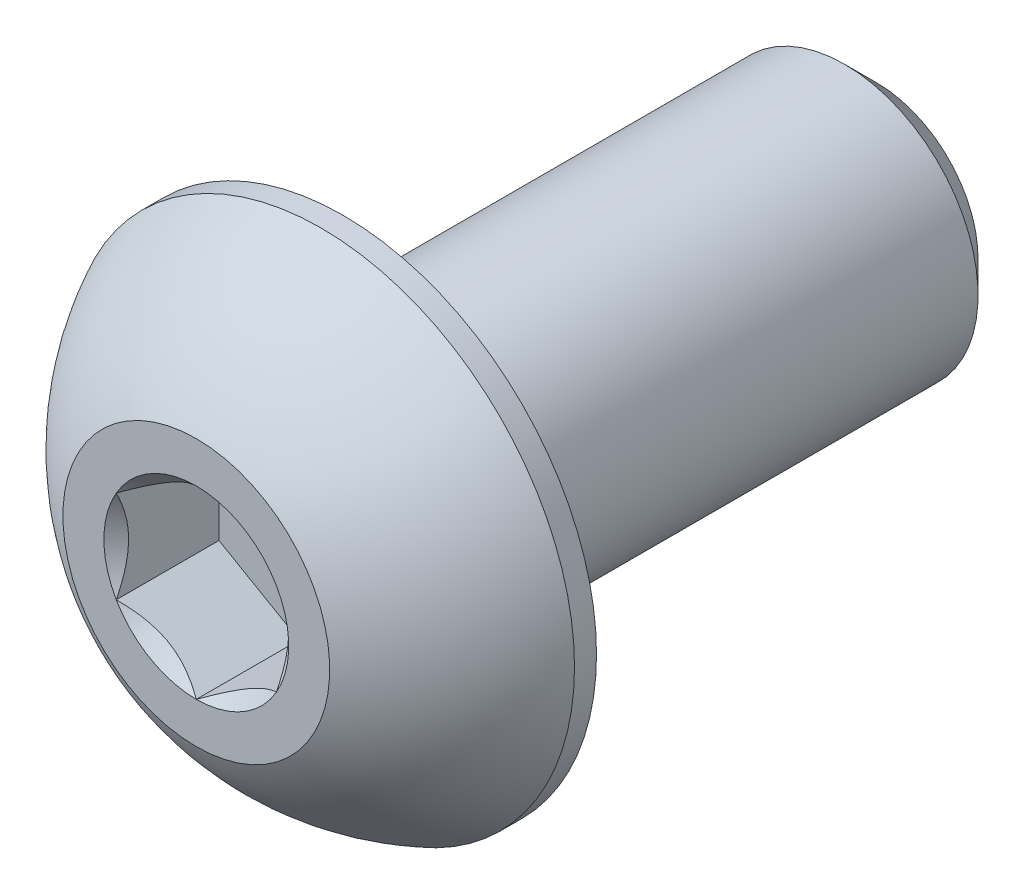
ISO-10303-21;
HEADER;
FILE_DESCRIPTION(('STEP AP214'),'2;1');
FILE_NAME('part.step','',(''),(''),'','','');
FILE_SCHEMA(('AUTOMOTIVE_DESIGN { 1 0 10303 214 1 1 1 1 }'));
ENDSEC;
DATA;
#1=APPLICATION_CONTEXT('core data for automotive mechanical design processes');
#2=APPLICATION_PROTOCOL_DEFINITION('international standard','automotive_design',2000,#1);
#3=PRODUCT_CONTEXT('',#1,'mechanical');
#4=PRODUCT('Part','Part','',(#3));
#5=PRODUCT_RELATED_PRODUCT_CATEGORY('part','',(#4));
#6=PRODUCT_DEFINITION_FORMATION('','',#4);
#7=PRODUCT_DEFINITION_CONTEXT('part definition',#1,'design');
#8=PRODUCT_DEFINITION('design','',#6,#7);
#9=PRODUCT_DEFINITION_SHAPE('','',#8);
#10=(LENGTH_UNIT() NAMED_UNIT(*) SI_UNIT(.MILLI.,.METRE.));
#11=(NAMED_UNIT(*) PLANE_ANGLE_UNIT() SI_UNIT($,.RADIAN.));
#12=(NAMED_UNIT(*) SI_UNIT($,.STERADIAN.) SOLID_ANGLE_UNIT());
#13=UNCERTAINTY_MEASURE_WITH_UNIT(LENGTH_MEASURE(1.E-05),#10,'distance_accuracy_value','');
#14=(GEOMETRIC_REPRESENTATION_CONTEXT(3) GLOBAL_UNCERTAINTY_ASSIGNED_CONTEXT((#13)) GLOBAL_UNIT_ASSIGNED_CONTEXT((#10,
#11,#12)) REPRESENTATION_CONTEXT('',''));
#15=CARTESIAN_POINT('',(0.,0.,0.));
#16=DIRECTION('',(0.,0.,1.));
#17=DIRECTION('',(1.,0.,0.));
#18=AXIS2_PLACEMENT_3D('',#15,#16,#17);
#19=CARTESIAN_POINT('',(0.,-2.5,-12.75));
#20=DIRECTION('',(0.,0.,-1.));
#21=DIRECTION('',(0.,1.,0.));
#22=AXIS2_PLACEMENT_3D('',#19,#20,#21);
#23=PLANE('',#22);
#24=CARTESIAN_POINT('',(0.,0.,-12.75));
#25=DIRECTION('',(0.,0.,-1.));
#26=DIRECTION('',(0.,1.,0.));
#27=AXIS2_PLACEMENT_3D('',#24,#25,#26);
#28=CIRCLE('',#27,1.9);
#29=CARTESIAN_POINT('',(0.,1.9,-12.75));
#30=VERTEX_POINT('',#29);
#31=EDGE_CURVE('E174',#30,#30,#28,.T.);
#32=ORIENTED_EDGE('',*,*,#31,.T.);
#33=EDGE_LOOP('',(#32));
#34=FACE_BOUND('',#33,.T.);
#35=ADVANCED_FACE('F34',(#34),#23,.T.);
#36=CARTESIAN_POINT('',(0.,0.,-12.75));
#37=DIRECTION('',(0.,0.,-1.));
#38=DIRECTION('',(0.,1.,0.));
#39=AXIS2_PLACEMENT_3D('',#36,#37,#38);
#40=CYLINDRICAL_SURFACE('',#39,2.5);
#41=CARTESIAN_POINT('',(0.,0.,-12.15));
#42=DIRECTION('',(0.,0.,-1.));
#43=DIRECTION('',(0.,1.,0.));
#44=AXIS2_PLACEMENT_3D('',#41,#42,#43);
#45=CIRCLE('',#44,2.5);
#46=CARTESIAN_POINT('',(0.,2.5,-12.15));
#47=VERTEX_POINT('',#46);
#48=EDGE_CURVE('E48',#47,#47,#45,.F.);
#49=ORIENTED_EDGE('',*,*,#48,.T.);
#50=EDGE_LOOP('',(#49));
#51=FACE_BOUND('',#50,.T.);
#52=CARTESIAN_POINT('',(0.,0.,-2.75));
#53=DIRECTION('',(0.,0.,1.));
#54=DIRECTION('',(1.,0.,0.));
#55=AXIS2_PLACEMENT_3D('',#52,#53,#54);
#56=CIRCLE('',#55,2.5);
#57=CARTESIAN_POINT('',(2.5,0.,-2.75));
#58=VERTEX_POINT('',#57);
#59=EDGE_CURVE('E171',#58,#58,#56,.F.);
#60=ORIENTED_EDGE('',*,*,#59,.T.);
#61=EDGE_LOOP('',(#60));
#62=FACE_BOUND('',#61,.T.);
#63=ADVANCED_FACE('F179',(#51,#62),#40,.T.);
#64=CARTESIAN_POINT('',(0.,0.,-12.75));
#65=DIRECTION('',(0.,0.,1.));
#66=DIRECTION('',(0.,-1.,0.));
#67=AXIS2_PLACEMENT_3D('',#64,#65,#66);
#68=CONICAL_SURFACE('',#67,1.9,0.785398163397447);
#69=ORIENTED_EDGE('',*,*,#48,.F.);
#70=EDGE_LOOP('',(#69));
#71=FACE_BOUND('',#70,.T.);
#72=ORIENTED_EDGE('',*,*,#31,.F.);
#73=EDGE_LOOP('',(#72));
#74=FACE_BOUND('',#73,.T.);
#75=ADVANCED_FACE('F36',(#71,#74),#68,.T.);
#76=CARTESIAN_POINT('',(0.,0.,-4.65805481283422));
#77=DIRECTION('',(0.,0.,1.));
#78=DIRECTION('',(0.,-1.,0.));
#79=AXIS2_PLACEMENT_3D('',#76,#77,#78);
#80=SPHERICAL_SURFACE('',#79,5.28653711226622);
#81=CARTESIAN_POINT('',(0.,0.,0.));
#82=DIRECTION('',(0.,0.,1.));
#83=DIRECTION('',(1.,0.,0.));
#84=AXIS2_PLACEMENT_3D('',#81,#82,#83);
#85=CIRCLE('',#84,2.5);
#86=CARTESIAN_POINT('',(0.,-2.5,0.));
#87=VERTEX_POINT('',#86);
#88=EDGE_CURVE('E168',#87,#87,#85,.T.);
#89=CARTESIAN_POINT('',(0.,0.,-2.3375));
#90=DIRECTION('',(0.,0.,1.));
#91=DIRECTION('',(1.,0.,0.));
#92=AXIS2_PLACEMENT_3D('',#89,#90,#91);
#93=CIRCLE('',#92,4.75);
#94=CARTESIAN_POINT('',(0.,-4.75,-2.3375));
#95=VERTEX_POINT('',#94);
#96=EDGE_CURVE('E162',#95,#95,#93,.T.);
#97=CARTESIAN_POINT('',(0.,-2.5,0.));
#98=CARTESIAN_POINT('',(0.,-2.53026679982017,-0.016244282455609));
#99=CARTESIAN_POINT('',(0.,-2.56037522904968,-0.0327836412064128));
#100=CARTESIAN_POINT('',(0.,-2.62026400427657,-0.0664460518821871));
#101=CARTESIAN_POINT('',(0.,-2.65004435027396,-0.0835691038071575));
#102=CARTESIAN_POINT('',(0.,-2.70926561698584,-0.11839244141504));
#103=CARTESIAN_POINT('',(0.,-2.73870653770032,-0.136092727097952));
#104=CARTESIAN_POINT('',(0.,-2.79723777417103,-0.172063794044945));
#105=CARTESIAN_POINT('',(0.,-2.82632808992726,-0.190334575309027));
#106=CARTESIAN_POINT('',(0.,-2.8841470610759,-0.227439694392676));
#107=CARTESIAN_POINT('',(0.,-2.91287571646831,-0.246274032212244));
#108=CARTESIAN_POINT('',(0.,-2.96996045130294,-0.284499106978588));
#109=CARTESIAN_POINT('',(0.,-2.99831653074515,-0.303889843925365));
#110=CARTESIAN_POINT('',(0.,-3.05464533901892,-0.343220349244854));
#111=CARTESIAN_POINT('',(0.,-3.08261806785047,-0.363160117617566));
#112=CARTESIAN_POINT('',(0.,-3.13816954607727,-0.403581109164589));
#113=CARTESIAN_POINT('',(0.,-3.16574829547251,-0.424062332338901));
#114=CARTESIAN_POINT('',(0.,-3.22050133565615,-0.465558451209038));
#115=CARTESIAN_POINT('',(0.,-3.24767562644455,-0.486573346904865));
#116=CARTESIAN_POINT('',(0.,-3.30160942393942,-0.529128825735185));
#117=CARTESIAN_POINT('',(0.,-3.32836893064589,-0.550669408869678));
#118=CARTESIAN_POINT('',(0.,-3.38146299210494,-0.594268077753708));
#119=CARTESIAN_POINT('',(0.,-3.40779754685753,-0.616326163503246));
#120=CARTESIAN_POINT('',(0.,-3.46003169800773,-0.660951456155511));
#121=CARTESIAN_POINT('',(0.,-3.48593129440535,-0.683518663058237));
#122=CARTESIAN_POINT('',(0.,-3.53728568771641,-0.729153623103509));
#123=CARTESIAN_POINT('',(0.,-3.56274048462986,-0.752221376246055));
#124=CARTESIAN_POINT('',(0.,-3.61319560685493,-0.798848663663778));
#125=CARTESIAN_POINT('',(0.,-3.63819593216655,-0.822408197938956));
#126=CARTESIAN_POINT('',(0.,-3.68773261175691,-0.870010095651582));
#127=CARTESIAN_POINT('',(0.,-3.71226896603565,-0.89405245908903));
#128=CARTESIAN_POINT('',(0.,-3.76086838042534,-0.942610879694118));
#129=CARTESIAN_POINT('',(0.,-3.78493144053629,-0.967126936861757));
#130=CARTESIAN_POINT('',(0.,-3.83257512329416,-1.01662342950466));
#131=CARTESIAN_POINT('',(0.,-3.85615574594108,-1.04160386497992));
#132=CARTESIAN_POINT('',(0.,-3.90282559378753,-1.0920196223646));
#133=CARTESIAN_POINT('',(0.,-3.92591481898706,-1.11745494427402));
#134=CARTESIAN_POINT('',(0.,-3.97159309867276,-1.1687708098093));
#135=CARTESIAN_POINT('',(0.,-3.99418215315894,-1.19465135343517));
#136=CARTESIAN_POINT('',(0.,-4.03885150820303,-1.24684782851373));
#137=CARTESIAN_POINT('',(0.,-4.06093180876094,-1.27316375996643));
#138=CARTESIAN_POINT('',(0.,-4.10457526604591,-1.32622101137371));
#139=CARTESIAN_POINT('',(0.,-4.12613842277298,-1.3529623313283));
#140=CARTESIAN_POINT('',(0.,-4.16873939899418,-1.40686019877854));
#141=CARTESIAN_POINT('',(0.,-4.1897772184883,-1.4340167462742));
#142=CARTESIAN_POINT('',(0.,-4.23131952645464,-1.488734750071));
#143=CARTESIAN_POINT('',(0.,-4.25182401492686,-1.51629620637214));
#144=CARTESIAN_POINT('',(0.,-4.29229186971308,-1.5718135551894));
#145=CARTESIAN_POINT('',(0.,-4.31225523602708,-1.59976944770551));
#146=CARTESIAN_POINT('',(0.,-4.35163326096594,-1.65606504649041));
#147=CARTESIAN_POINT('',(0.,-4.3710479195908,-1.6844047527592));
#148=CARTESIAN_POINT('',(0.,-4.40932115213664,-1.74145721073709));
#149=CARTESIAN_POINT('',(0.,-4.42817972605763,-1.77016996244618));
#150=CARTESIAN_POINT('',(0.,-4.46533362339398,-1.82795760128832));
#151=CARTESIAN_POINT('',(0.,-4.48362894680934,-1.85703248842136));
#152=CARTESIAN_POINT('',(0.,-4.51964939166499,-1.91553335033324));
#153=CARTESIAN_POINT('',(0.,-4.53737451310527,-1.94495932511208));
#154=CARTESIAN_POINT('',(0.,-4.57224781803529,-2.00415118173237));
#155=CARTESIAN_POINT('',(0.,-4.58939600152503,-2.03391706357382));
#156=CARTESIAN_POINT('',(0.,-4.62310891815402,-2.09377742234707));
#157=CARTESIAN_POINT('',(0.,-4.63967365129327,-2.12387189927887));
#158=CARTESIAN_POINT('',(0.,-4.67221336026297,-2.18437801974018));
#159=CARTESIAN_POINT('',(0.,-4.68818833609342,-2.21478966326969));
#160=CARTESIAN_POINT('',(0.,-4.71954250823692,-2.27591853680649));
#161=CARTESIAN_POINT('',(0.,-4.73492170454996,-2.30663576681378));
#162=CARTESIAN_POINT('',(0.,-4.75,-2.3375));
#163=B_SPLINE_CURVE_WITH_KNOTS('',3,(#97,#98,#99,#100,#101,#102,#103,#104,#105,#106,#107,#108,
#109,#110,#111,#112,#113,#114,#115,#116,#117,#118,#119,#120,#121,#122,#123,#124,#125,#126,#127,
#128,#129,#130,#131,#132,#133,#134,#135,#136,#137,#138,#139,#140,#141,#142,#143,#144,#145,#146,
#147,#148,#149,#150,#151,#152,#153,#154,#155,#156,#157,#158,#159,#160,#161,#162),.UNSPECIFIED.,
.F.,.F.,(4,2,2,2,2,2,2,2,2,2,2,2,2,2,2,2,2,2,2,2,2,2,2,2,2,2,2,2,2,2,2,2,4),(0.,
0.10304982363783,0.206099647275662,0.309149470913491,0.412199294551322,0.515249118189152,
0.618298941826983,0.721348765464812,0.824398589102643,0.927448412740473,1.0304982363783,
1.13354806001613,1.23659788365396,1.33964770729179,1.44269753092962,1.54574735456745,
1.64879717820529,1.75184700184312,1.85489682548095,1.95794664911878,2.06099647275661,
2.16404629639444,2.26709612003227,2.3701459436701,2.47319576730793,2.57624559094576,
2.67929541458359,2.78234523822142,2.88539506185925,2.98844488549708,3.09149470913491,
3.19454453277274,3.29759435641057),.UNSPECIFIED.);
#164=EDGE_CURVE('BSEAM184',#87,#95,#163,.T.);
#165=ORIENTED_EDGE('',*,*,#88,.F.);
#166=ORIENTED_EDGE('',*,*,#96,.T.);
#167=ORIENTED_EDGE('',*,*,#164,.T.);
#168=ORIENTED_EDGE('',*,*,#164,.F.);
#169=EDGE_LOOP('',(#165,#167,#166,#168));
#170=FACE_BOUND('',#169,.T.);
#171=ADVANCED_FACE('F184',(#170),#80,.T.);
#172=CARTESIAN_POINT('',(0.,-2.5,0.));
#173=DIRECTION('',(0.,0.,-1.));
#174=DIRECTION('',(-1.,0.,0.));
#175=AXIS2_PLACEMENT_3D('',#172,#173,#174);
#176=PLANE('',#175);
#177=CARTESIAN_POINT('',(0.,0.,0.));
#178=DIRECTION('',(0.,0.,1.));
#179=DIRECTION('',(1.,0.,0.));
#180=AXIS2_PLACEMENT_3D('',#177,#178,#179);
#181=CIRCLE('',#180,1.73205080756888);
#182=CARTESIAN_POINT('',(-1.5,0.866025403784438,0.));
#183=VERTEX_POINT('',#182);
#184=CARTESIAN_POINT('',(-1.5,-0.866025403784439,0.));
#185=VERTEX_POINT('',#184);
#186=EDGE_CURVE('E61',#183,#185,#181,.T.);
#187=ORIENTED_EDGE('',*,*,#186,.F.);
#188=CARTESIAN_POINT('',(0.,1.73205080756888,0.));
#189=VERTEX_POINT('',#188);
#190=EDGE_CURVE('E133',#189,#183,#181,.T.);
#191=ORIENTED_EDGE('',*,*,#190,.F.);
#192=CARTESIAN_POINT('',(1.5,0.866025403784439,0.));
#193=VERTEX_POINT('',#192);
#194=EDGE_CURVE('E130',#193,#189,#181,.T.);
#195=ORIENTED_EDGE('',*,*,#194,.F.);
#196=CARTESIAN_POINT('',(1.5,-0.866025403784439,0.));
#197=VERTEX_POINT('',#196);
#198=EDGE_CURVE('E101',#197,#193,#181,.T.);
#199=ORIENTED_EDGE('',*,*,#198,.F.);
#200=CARTESIAN_POINT('',(0.,-1.73205080756888,0.));
#201=VERTEX_POINT('',#200);
#202=EDGE_CURVE('E93',#201,#197,#181,.T.);
#203=ORIENTED_EDGE('',*,*,#202,.F.);
#204=EDGE_CURVE('E54',#185,#201,#181,.T.);
#205=ORIENTED_EDGE('',*,*,#204,.F.);
#206=EDGE_LOOP('',(#187,#191,#195,#199,#203,#205));
#207=FACE_BOUND('',#206,.T.);
#208=ORIENTED_EDGE('',*,*,#88,.T.);
#209=EDGE_LOOP('',(#208));
#210=FACE_BOUND('',#209,.T.);
#211=ADVANCED_FACE('F127',(#207,#210),#176,.F.);
#212=CARTESIAN_POINT('',(0.,-4.75,-2.75));
#213=DIRECTION('',(0.,0.,1.));
#214=DIRECTION('',(1.,0.,0.));
#215=AXIS2_PLACEMENT_3D('',#212,#213,#214);
#216=PLANE('',#215);
#217=ORIENTED_EDGE('',*,*,#59,.F.);
#218=EDGE_LOOP('',(#217));
#219=FACE_BOUND('',#218,.T.);
#220=CARTESIAN_POINT('',(0.,0.,-2.75));
#221=DIRECTION('',(0.,0.,1.));
#222=DIRECTION('',(1.,0.,0.));
#223=AXIS2_PLACEMENT_3D('',#220,#221,#222);
#224=CIRCLE('',#223,4.75);
#225=CARTESIAN_POINT('',(4.75,0.,-2.75));
#226=VERTEX_POINT('',#225);
#227=EDGE_CURVE('E165',#226,#226,#224,.T.);
#228=ORIENTED_EDGE('',*,*,#227,.F.);
#229=EDGE_LOOP('',(#228));
#230=FACE_BOUND('',#229,.T.);
#231=ADVANCED_FACE('F198',(#219,#230),#216,.F.);
#232=CARTESIAN_POINT('',(0.,0.,0.));
#233=DIRECTION('',(0.,0.,1.));
#234=DIRECTION('',(1.,0.,0.));
#235=AXIS2_PLACEMENT_3D('',#232,#233,#234);
#236=CYLINDRICAL_SURFACE('',#235,4.75);
#237=ORIENTED_EDGE('',*,*,#96,.F.);
#238=EDGE_LOOP('',(#237));
#239=FACE_BOUND('',#238,.T.);
#240=ORIENTED_EDGE('',*,*,#227,.T.);
#241=EDGE_LOOP('',(#240));
#242=FACE_BOUND('',#241,.T.);
#243=ADVANCED_FACE('F201',(#239,#242),#236,.T.);
#244=CARTESIAN_POINT('',(0.,0.,0.));
#245=DIRECTION('',(0.,0.,1.));
#246=DIRECTION('',(1.,0.,0.));
#247=AXIS2_PLACEMENT_3D('',#244,#245,#246);
#248=CONICAL_SURFACE('',#247,1.73205080756888,0.78539816339745);
#249=ORIENTED_EDGE('',*,*,#198,.T.);
#250=CARTESIAN_POINT('',(1.5,-1.72720812969692,0.555578516270791));
#251=CARTESIAN_POINT('',(1.5,-1.68515175699268,0.523829907857426));
#252=CARTESIAN_POINT('',(1.5,-1.64286104748673,0.492392593807383));
#253=CARTESIAN_POINT('',(1.5,-1.55771581035942,0.430269087556409));
#254=CARTESIAN_POINT('',(1.5,-1.51486114386668,0.399583085892202));
#255=CARTESIAN_POINT('',(1.5,-1.3846813415127,0.30840719242716));
#256=CARTESIAN_POINT('',(1.5,-1.29637976071654,0.249288343426773));
#257=CARTESIAN_POINT('',(1.5,-1.11121478730467,0.133230996316504));
#258=CARTESIAN_POINT('',(1.5,-1.01415038238167,0.0766095587330078));
#259=CARTESIAN_POINT('',(1.5,-0.815173408897605,-0.0269631187343472));
#260=CARTESIAN_POINT('',(1.5,-0.713278669253285,-0.0739469584583305));
#261=CARTESIAN_POINT('',(1.5,-0.560333774943111,-0.13142733156917));
#262=CARTESIAN_POINT('',(1.5,-0.511547982948042,-0.147924612242751));
#263=CARTESIAN_POINT('',(1.5,-0.412798620136866,-0.177002487072996));
#264=CARTESIAN_POINT('',(1.5,-0.362834968437562,-0.189582811405981));
#265=CARTESIAN_POINT('',(1.5,-0.262863235444982,-0.20996380585323));
#266=CARTESIAN_POINT('',(1.5,-0.212872113808022,-0.21784636725402));
#267=CARTESIAN_POINT('',(1.5,-0.112355243569545,-0.228677936030997));
#268=CARTESIAN_POINT('',(1.5,-0.0618295883726279,-0.231627791475649));
#269=CARTESIAN_POINT('',(1.5,0.037429173332384,-0.23237514227515));
#270=CARTESIAN_POINT('',(1.5,0.0861609672002989,-0.230355266441925));
#271=CARTESIAN_POINT('',(1.5,0.183206937768827,-0.221677447103242));
#272=CARTESIAN_POINT('',(1.5,0.231521073438269,-0.215019053031544));
#273=CARTESIAN_POINT('',(1.5,0.328199853425435,-0.197314755877433));
#274=CARTESIAN_POINT('',(1.5,0.376550616310328,-0.186194188742961));
#275=CARTESIAN_POINT('',(1.5,0.472195697125598,-0.160156585951288));
#276=CARTESIAN_POINT('',(1.5,0.51949010309274,-0.145239867959065));
#277=CARTESIAN_POINT('',(1.5,0.668391282696624,-0.0926647764039276));
#278=CARTESIAN_POINT('',(1.5,0.767878709508552,-0.0490187125280247));
#279=CARTESIAN_POINT('',(1.5,0.962179866690724,0.048022994593097));
#280=CARTESIAN_POINT('',(1.5,1.05697519961444,0.101453665089533));
#281=CARTESIAN_POINT('',(1.5,1.23814273533383,0.211685852004558));
#282=CARTESIAN_POINT('',(1.5,1.3246994218129,0.268187920698596));
#283=CARTESIAN_POINT('',(1.5,1.45222331290673,0.355534301578659));
#284=CARTESIAN_POINT('',(1.5,1.49418091978756,0.384957758680043));
#285=CARTESIAN_POINT('',(1.5,1.57752272931476,0.444582821830463));
#286=CARTESIAN_POINT('',(1.5,1.61890708647354,0.474784211664437));
#287=CARTESIAN_POINT('',(1.5,1.66005278019494,0.505308178609455));
#288=B_SPLINE_CURVE_WITH_KNOTS('',3,(#250,#251,#252,#253,#254,#255,#256,#257,#258,#259,#260,
#261,#262,#263,#264,#265,#266,#267,#268,#269,#270,#271,#272,#273,#274,#275,#276,#277,#278,#279,
#280,#281,#282,#283,#284,#285,#286,#287),.UNSPECIFIED.,.F.,.F.,(4,2,2,2,2,2,2,2,2,2,2,2,2,2,2,2,
2,2,4),(0.,0.158079548982668,0.316198780993942,0.634850417346958,0.97169031136151,
1.30737131660667,1.46173961127089,1.61611853740677,1.7677210142141,1.91929742368538,
2.065387412096,2.21149159305544,2.36014984633872,2.50879566386709,2.83376031422673,
3.15991186985652,3.46985601802197,3.62358896039974,3.7772796264207),.UNSPECIFIED.);
#289=EDGE_CURVE('E11',#197,#193,#288,.T.);
#290=ORIENTED_EDGE('',*,*,#289,.F.);
#291=EDGE_LOOP('',(#249,#290));
#292=FACE_BOUND('',#291,.T.);
#293=ADVANCED_FACE('F105',(#292),#248,.F.);
#294=ORIENTED_EDGE('',*,*,#194,.T.);
#295=CARTESIAN_POINT('',(1.5002,0.865909933730601,0.000115481600073575));
#296=CARTESIAN_POINT('',(1.44863220926292,0.895682611594166,-0.0296345239326721));
#297=CARTESIAN_POINT('',(1.3962020823348,0.925953159489765,-0.0576375160896874));
#298=CARTESIAN_POINT('',(1.2892909659444,0.987678321317124,-0.108910769559858));
#299=CARTESIAN_POINT('',(1.23479980418534,1.01913880822718,-0.132152494955627));
#300=CARTESIAN_POINT('',(1.12492091864275,1.08257741237344,-0.17196627100778));
#301=CARTESIAN_POINT('',(1.0695611909048,1.11453936608521,-0.188638414329104));
#302=CARTESIAN_POINT('',(0.957622742522848,1.1791670593912,-0.214325543181897));
#303=CARTESIAN_POINT('',(0.90104744344699,1.21183082354213,-0.223359709521134));
#304=CARTESIAN_POINT('',(0.803544610483558,1.26812411040032,-0.231510918773148));
#305=CARTESIAN_POINT('',(0.762743091719533,1.29168087824208,-0.232717747010783));
#306=CARTESIAN_POINT('',(0.68121203038414,1.33875285845138,-0.230685942837733));
#307=CARTESIAN_POINT('',(0.640482505685369,1.36226806050018,-0.227446329251692));
#308=CARTESIAN_POINT('',(0.559415597836583,1.40907206156905,-0.216708014018038));
#309=CARTESIAN_POINT('',(0.51907861540171,1.43236062923612,-0.209205346981267));
#310=CARTESIAN_POINT('',(0.439081663085968,1.47854689118997,-0.190348388071709));
#311=CARTESIAN_POINT('',(0.399421991483791,1.50144441326545,-0.178992442981415));
#312=CARTESIAN_POINT('',(0.297836865225514,1.56009461325633,-0.145278352407328));
#313=CARTESIAN_POINT('',(0.23654144629031,1.59548353987866,-0.120378150906633));
#314=CARTESIAN_POINT('',(0.146414371536686,1.64751843074894,-0.0783433467284235));
#315=CARTESIAN_POINT('',(0.116714860092281,1.66466545167617,-0.0635748464409036));
#316=CARTESIAN_POINT('',(0.0578620986162484,1.69864410935691,-0.0326894340598312));
#317=CARTESIAN_POINT('',(0.0287085957793622,1.71547589206761,-0.0165731658782895));
#318=CARTESIAN_POINT('',(-0.000200000000000444,1.73216627762272,0.000115481600073434));
#319=B_SPLINE_CURVE_WITH_KNOTS('',3,(#295,#296,#297,#298,#299,#300,#301,#302,#303,#304,#305,
#306,#307,#308,#309,#310,#311,#312,#313,#314,#315,#316,#317,#318),.UNSPECIFIED.,.F.,.F.,(4,2,2,
2,2,2,2,2,2,2,2,4),(0.,0.199829143693305,0.40082298738239,0.598623720538182,0.795926240188891,
0.937113067959883,1.07833105577193,1.21968061668222,1.36109089931055,1.58570969637566,
1.69770705470964,1.80965120737194),.UNSPECIFIED.);
#320=EDGE_CURVE('E132',#193,#189,#319,.T.);
#321=ORIENTED_EDGE('',*,*,#320,.F.);
#322=EDGE_LOOP('',(#294,#321));
#323=FACE_BOUND('',#322,.T.);
#324=ADVANCED_FACE('F286',(#323),#248,.F.);
#325=ORIENTED_EDGE('',*,*,#190,.T.);
#326=CARTESIAN_POINT('',(0.000199999999999626,1.73216627762272,0.000115481600073681));
#327=CARTESIAN_POINT('',(-0.0513677907370761,1.70239359975915,-0.029634523932672));
#328=CARTESIAN_POINT('',(-0.103797917665201,1.67212305186355,-0.0576375160896872));
#329=CARTESIAN_POINT('',(-0.210709034055597,1.61039789003619,-0.108910769559857));
#330=CARTESIAN_POINT('',(-0.265200195814661,1.57893740312614,-0.132152494955627));
#331=CARTESIAN_POINT('',(-0.375079081357249,1.51549879897987,-0.17196627100778));
#332=CARTESIAN_POINT('',(-0.4304388090952,1.4835368452681,-0.188638414329104));
#333=CARTESIAN_POINT('',(-0.542377257477151,1.41890915196211,-0.214325543181897));
#334=CARTESIAN_POINT('',(-0.598952556553009,1.38624538781118,-0.223359709521134));
#335=CARTESIAN_POINT('',(-0.696455389516441,1.32995210095299,-0.231510918773148));
#336=CARTESIAN_POINT('',(-0.737256908280467,1.30639533311124,-0.232717747010783));
#337=CARTESIAN_POINT('',(-0.818787969615859,1.25932335290193,-0.230685942837733));
#338=CARTESIAN_POINT('',(-0.859517494314631,1.23580815085313,-0.227446329251693));
#339=CARTESIAN_POINT('',(-0.940584402163417,1.18900414978427,-0.216708014018038));
#340=CARTESIAN_POINT('',(-0.980921384598289,1.16571558211719,-0.209205346981267));
#341=CARTESIAN_POINT('',(-1.06091833691403,1.11952932016335,-0.19034838807171));
#342=CARTESIAN_POINT('',(-1.10057800851621,1.09663179808786,-0.178992442981415));
#343=CARTESIAN_POINT('',(-1.20216313477449,1.03798159809698,-0.145278352407329));
#344=CARTESIAN_POINT('',(-1.26345855370969,1.00259267147465,-0.120378150906633));
#345=CARTESIAN_POINT('',(-1.35358562846331,0.950557780604374,-0.0783433467284239));
#346=CARTESIAN_POINT('',(-1.38328513990772,0.933410759677147,-0.0635748464409042));
#347=CARTESIAN_POINT('',(-1.44213790138375,0.899432101996406,-0.0326894340598318));
#348=CARTESIAN_POINT('',(-1.47129140422064,0.882600319285709,-0.0165731658782901));
#349=CARTESIAN_POINT('',(-1.5002,0.8659099337306,0.000115481600073071));
#350=B_SPLINE_CURVE_WITH_KNOTS('',3,(#326,#327,#328,#329,#330,#331,#332,#333,#334,#335,#336,
#337,#338,#339,#340,#341,#342,#343,#344,#345,#346,#347,#348,#349),.UNSPECIFIED.,.F.,.F.,(4,2,2,
2,2,2,2,2,2,2,2,4),(0.,0.199829143693305,0.400822987382389,0.598623720538181,0.79592624018889,
0.937113067959882,1.07833105577193,1.21968061668222,1.36109089931055,1.58570969637566,
1.69770705470964,1.80965120737194),.UNSPECIFIED.);
#351=EDGE_CURVE('E137',#189,#183,#350,.T.);
#352=ORIENTED_EDGE('',*,*,#351,.F.);
#353=EDGE_LOOP('',(#325,#352));
#354=FACE_BOUND('',#353,.T.);
#355=ADVANCED_FACE('F140',(#354),#248,.F.);
#356=ORIENTED_EDGE('',*,*,#186,.T.);
#357=CARTESIAN_POINT('',(-1.5,-1.72720812969693,0.555578516270791));
#358=CARTESIAN_POINT('',(-1.5,-1.68515175699268,0.523829907857427));
#359=CARTESIAN_POINT('',(-1.5,-1.64286104748674,0.492392593807383));
#360=CARTESIAN_POINT('',(-1.5,-1.55771581035942,0.430269087556409));
#361=CARTESIAN_POINT('',(-1.5,-1.51486114386668,0.399583085892202));
#362=CARTESIAN_POINT('',(-1.5,-1.3846813415127,0.30840719242716));
#363=CARTESIAN_POINT('',(-1.5,-1.29637976071654,0.249288343426773));
#364=CARTESIAN_POINT('',(-1.5,-1.11121478730467,0.133230996316504));
#365=CARTESIAN_POINT('',(-1.5,-1.01415038238167,0.076609558733008));
#366=CARTESIAN_POINT('',(-1.5,-0.815173408897606,-0.026963118734347));
#367=CARTESIAN_POINT('',(-1.5,-0.713278669253285,-0.0739469584583305));
#368=CARTESIAN_POINT('',(-1.5,-0.560333774943112,-0.13142733156917));
#369=CARTESIAN_POINT('',(-1.5,-0.511547982948042,-0.147924612242751));
#370=CARTESIAN_POINT('',(-1.5,-0.412798620136866,-0.177002487072996));
#371=CARTESIAN_POINT('',(-1.5,-0.362834968437562,-0.189582811405981));
#372=CARTESIAN_POINT('',(-1.5,-0.262863235444982,-0.20996380585323));
#373=CARTESIAN_POINT('',(-1.5,-0.212872113808022,-0.21784636725402));
#374=CARTESIAN_POINT('',(-1.5,-0.112355243569545,-0.228677936030997));
#375=CARTESIAN_POINT('',(-1.5,-0.0618295883726279,-0.231627791475649));
#376=CARTESIAN_POINT('',(-1.5,0.0374291733323841,-0.23237514227515));
#377=CARTESIAN_POINT('',(-1.5,0.0861609672002989,-0.230355266441925));
#378=CARTESIAN_POINT('',(-1.5,0.183206937768827,-0.221677447103242));
#379=CARTESIAN_POINT('',(-1.5,0.231521073438269,-0.215019053031544));
#380=CARTESIAN_POINT('',(-1.5,0.328199853425435,-0.197314755877433));
#381=CARTESIAN_POINT('',(-1.5,0.376550616310328,-0.186194188742961));
#382=CARTESIAN_POINT('',(-1.5,0.472195697125598,-0.160156585951288));
#383=CARTESIAN_POINT('',(-1.5,0.51949010309274,-0.145239867959065));
#384=CARTESIAN_POINT('',(-1.5,0.668391282696624,-0.0926647764039277));
#385=CARTESIAN_POINT('',(-1.5,0.767878709508553,-0.0490187125280249));
#386=CARTESIAN_POINT('',(-1.5,0.962179866690724,0.0480229945930968));
#387=CARTESIAN_POINT('',(-1.5,1.05697519961444,0.101453665089533));
#388=CARTESIAN_POINT('',(-1.5,1.23814273533383,0.211685852004558));
#389=CARTESIAN_POINT('',(-1.5,1.3246994218129,0.268187920698596));
#390=CARTESIAN_POINT('',(-1.5,1.45222331290673,0.355534301578659));
#391=CARTESIAN_POINT('',(-1.5,1.49418091978756,0.384957758680043));
#392=CARTESIAN_POINT('',(-1.5,1.57752272931476,0.444582821830464));
#393=CARTESIAN_POINT('',(-1.5,1.61890708647354,0.474784211664437));
#394=CARTESIAN_POINT('',(-1.5,1.66005278019494,0.505308178609456));
#395=B_SPLINE_CURVE_WITH_KNOTS('',3,(#357,#358,#359,#360,#361,#362,#363,#364,#365,#366,#367,
#368,#369,#370,#371,#372,#373,#374,#375,#376,#377,#378,#379,#380,#381,#382,#383,#384,#385,#386,
#387,#388,#389,#390,#391,#392,#393,#394),.UNSPECIFIED.,.F.,.F.,(4,2,2,2,2,2,2,2,2,2,2,2,2,2,2,2,
2,2,4),(0.,0.158079548982669,0.316198780993942,0.634850417346958,0.97169031136151,
1.30737131660667,1.46173961127089,1.61611853740677,1.7677210142141,1.91929742368538,
2.065387412096,2.21149159305544,2.36014984633872,2.5087956638671,2.83376031422673,
3.15991186985652,3.46985601802198,3.62358896039974,3.7772796264207),.UNSPECIFIED.);
#396=EDGE_CURVE('E144',#183,#185,#395,.F.);
#397=ORIENTED_EDGE('',*,*,#396,.F.);
#398=EDGE_LOOP('',(#356,#397));
#399=FACE_BOUND('',#398,.T.);
#400=ADVANCED_FACE('F280',(#399),#248,.F.);
#401=ORIENTED_EDGE('',*,*,#204,.T.);
#402=CARTESIAN_POINT('',(-1.5002,-0.865909933730601,0.000115481600073141));
#403=CARTESIAN_POINT('',(-1.44863220926292,-0.895682611594166,-0.0296345239326724));
#404=CARTESIAN_POINT('',(-1.3962020823348,-0.925953159489765,-0.0576375160896875));
#405=CARTESIAN_POINT('',(-1.2892909659444,-0.987678321317124,-0.108910769559857));
#406=CARTESIAN_POINT('',(-1.23479980418534,-1.01913880822718,-0.132152494955627));
#407=CARTESIAN_POINT('',(-1.12492091864275,-1.08257741237344,-0.17196627100778));
#408=CARTESIAN_POINT('',(-1.0695611909048,-1.11453936608521,-0.188638414329104));
#409=CARTESIAN_POINT('',(-0.957622742522849,-1.1791670593912,-0.214325543181897));
#410=CARTESIAN_POINT('',(-0.901047443446991,-1.21183082354213,-0.223359709521134));
#411=CARTESIAN_POINT('',(-0.803544610483559,-1.26812411040032,-0.231510918773148));
#412=CARTESIAN_POINT('',(-0.762743091719534,-1.29168087824208,-0.232717747010783));
#413=CARTESIAN_POINT('',(-0.681212030384142,-1.33875285845138,-0.230685942837733));
#414=CARTESIAN_POINT('',(-0.64048250568537,-1.36226806050018,-0.227446329251692));
#415=CARTESIAN_POINT('',(-0.559415597836584,-1.40907206156905,-0.216708014018038));
#416=CARTESIAN_POINT('',(-0.519078615401712,-1.43236062923612,-0.209205346981267));
#417=CARTESIAN_POINT('',(-0.439081663085969,-1.47854689118996,-0.19034838807171));
#418=CARTESIAN_POINT('',(-0.399421991483792,-1.50144441326545,-0.178992442981415));
#419=CARTESIAN_POINT('',(-0.297836865225515,-1.56009461325633,-0.145278352407329));
#420=CARTESIAN_POINT('',(-0.236541446290311,-1.59548353987866,-0.120378150906633));
#421=CARTESIAN_POINT('',(-0.146414371536686,-1.64751843074894,-0.0783433467284236));
#422=CARTESIAN_POINT('',(-0.116714860092282,-1.66466545167617,-0.0635748464409036));
#423=CARTESIAN_POINT('',(-0.0578620986162485,-1.69864410935691,-0.0326894340598309));
#424=CARTESIAN_POINT('',(-0.0287085957793622,-1.71547589206761,-0.0165731658782891));
#425=CARTESIAN_POINT('',(0.000200000000000573,-1.73216627762272,0.000115481600073829));
#426=B_SPLINE_CURVE_WITH_KNOTS('',3,(#402,#403,#404,#405,#406,#407,#408,#409,#410,#411,#412,
#413,#414,#415,#416,#417,#418,#419,#420,#421,#422,#423,#424,#425),.UNSPECIFIED.,.F.,.F.,(4,2,2,
2,2,2,2,2,2,2,2,4),(0.,0.199829143693305,0.400822987382389,0.598623720538181,0.795926240188889,
0.937113067959881,1.07833105577193,1.21968061668222,1.36109089931054,1.58570969637565,
1.69770705470964,1.80965120737194),.UNSPECIFIED.);
#427=EDGE_CURVE('E117',#185,#201,#426,.T.);
#428=ORIENTED_EDGE('',*,*,#427,.F.);
#429=EDGE_LOOP('',(#401,#428));
#430=FACE_BOUND('',#429,.T.);
#431=ADVANCED_FACE('F228',(#430),#248,.F.);
#432=ORIENTED_EDGE('',*,*,#202,.T.);
#433=CARTESIAN_POINT('',(-0.00019999999999946,-1.73216627762272,0.000115481600073879));
#434=CARTESIAN_POINT('',(0.0513677907370762,-1.70239359975915,-0.0296345239326719));
#435=CARTESIAN_POINT('',(0.103797917665201,-1.67212305186355,-0.0576375160896871));
#436=CARTESIAN_POINT('',(0.210709034055597,-1.61039789003619,-0.108910769559857));
#437=CARTESIAN_POINT('',(0.265200195814661,-1.57893740312614,-0.132152494955627));
#438=CARTESIAN_POINT('',(0.375079081357249,-1.51549879897987,-0.17196627100778));
#439=CARTESIAN_POINT('',(0.4304388090952,-1.4835368452681,-0.188638414329103));
#440=CARTESIAN_POINT('',(0.542377257477151,-1.41890915196211,-0.214325543181897));
#441=CARTESIAN_POINT('',(0.598952556553009,-1.38624538781118,-0.223359709521134));
#442=CARTESIAN_POINT('',(0.696455389516441,-1.32995210095299,-0.231510918773148));
#443=CARTESIAN_POINT('',(0.737256908280467,-1.30639533311124,-0.232717747010783));
#444=CARTESIAN_POINT('',(0.818787969615859,-1.25932335290193,-0.230685942837732));
#445=CARTESIAN_POINT('',(0.859517494314631,-1.23580815085313,-0.227446329251692));
#446=CARTESIAN_POINT('',(0.940584402163417,-1.18900414978427,-0.216708014018038));
#447=CARTESIAN_POINT('',(0.980921384598289,-1.16571558211719,-0.209205346981267));
#448=CARTESIAN_POINT('',(1.06091833691403,-1.11952932016335,-0.190348388071709));
#449=CARTESIAN_POINT('',(1.10057800851621,-1.09663179808786,-0.178992442981415));
#450=CARTESIAN_POINT('',(1.20216313477449,-1.03798159809698,-0.145278352407328));
#451=CARTESIAN_POINT('',(1.26345855370969,-1.00259267147465,-0.120378150906633));
#452=CARTESIAN_POINT('',(1.35358562846331,-0.950557780604374,-0.0783433467284236));
#453=CARTESIAN_POINT('',(1.38328513990772,-0.933410759677147,-0.0635748464409038));
#454=CARTESIAN_POINT('',(1.44213790138375,-0.899432101996406,-0.0326894340598314));
#455=CARTESIAN_POINT('',(1.47129140422064,-0.88260031928571,-0.0165731658782898));
#456=CARTESIAN_POINT('',(1.5002,-0.865909933730601,0.000115481600073133));
#457=B_SPLINE_CURVE_WITH_KNOTS('',3,(#433,#434,#435,#436,#437,#438,#439,#440,#441,#442,#443,
#444,#445,#446,#447,#448,#449,#450,#451,#452,#453,#454,#455,#456),.UNSPECIFIED.,.F.,.F.,(4,2,2,
2,2,2,2,2,2,2,2,4),(0.,0.199829143693305,0.400822987382389,0.598623720538181,0.79592624018889,
0.937113067959882,1.07833105577193,1.21968061668222,1.36109089931054,1.58570969637565,
1.69770705470964,1.80965120737194),.UNSPECIFIED.);
#458=EDGE_CURVE('E97',#201,#197,#457,.T.);
#459=ORIENTED_EDGE('',*,*,#458,.F.);
#460=EDGE_LOOP('',(#432,#459));
#461=FACE_BOUND('',#460,.T.);
#462=ADVANCED_FACE('F95',(#461),#248,.F.);
#463=CARTESIAN_POINT('',(1.5,-0.866025403784438,-1.925));
#464=DIRECTION('',(0.,0.,1.));
#465=DIRECTION('',(1.,0.,0.));
#466=AXIS2_PLACEMENT_3D('',#463,#464,#465);
#467=PLANE('',#466);
#468=DIRECTION('',(0.866025403784438,0.5,0.));
#469=VECTOR('',#468,1.);
#470=CARTESIAN_POINT('',(0.,-1.73205080756888,-1.925));
#471=LINE('',#470,#469);
#472=CARTESIAN_POINT('',(0.,-1.73205080756888,-1.925));
#473=VERTEX_POINT('',#472);
#474=CARTESIAN_POINT('',(1.5,-0.866025403784438,-1.925));
#475=VERTEX_POINT('',#474);
#476=EDGE_CURVE('E116',#473,#475,#471,.T.);
#477=ORIENTED_EDGE('',*,*,#476,.T.);
#478=DIRECTION('',(0.,1.,0.));
#479=VECTOR('',#478,1.);
#480=CARTESIAN_POINT('',(1.5,-0.866025403784438,-1.925));
#481=LINE('',#480,#479);
#482=CARTESIAN_POINT('',(1.5,0.866025403784439,-1.925));
#483=VERTEX_POINT('',#482);
#484=EDGE_CURVE('E121',#475,#483,#481,.T.);
#485=ORIENTED_EDGE('',*,*,#484,.T.);
#486=DIRECTION('',(-0.866025403784439,0.5,0.));
#487=VECTOR('',#486,1.);
#488=CARTESIAN_POINT('',(1.5,0.866025403784439,-1.925));
#489=LINE('',#488,#487);
#490=CARTESIAN_POINT('',(0.,1.73205080756888,-1.925));
#491=VERTEX_POINT('',#490);
#492=EDGE_CURVE('E270',#483,#491,#489,.T.);
#493=ORIENTED_EDGE('',*,*,#492,.T.);
#494=DIRECTION('',(-0.866025403784438,-0.5,0.));
#495=VECTOR('',#494,1.);
#496=CARTESIAN_POINT('',(0.,1.73205080756888,-1.925));
#497=LINE('',#496,#495);
#498=CARTESIAN_POINT('',(-1.5,0.866025403784438,-1.925));
#499=VERTEX_POINT('',#498);
#500=EDGE_CURVE('E153',#491,#499,#497,.T.);
#501=ORIENTED_EDGE('',*,*,#500,.T.);
#502=DIRECTION('',(0.,-1.,0.));
#503=VECTOR('',#502,1.);
#504=CARTESIAN_POINT('',(-1.5,0.866025403784438,-1.925));
#505=LINE('',#504,#503);
#506=CARTESIAN_POINT('',(-1.5,-0.866025403784439,-1.925));
#507=VERTEX_POINT('',#506);
#508=EDGE_CURVE('E274',#499,#507,#505,.T.);
#509=ORIENTED_EDGE('',*,*,#508,.T.);
#510=DIRECTION('',(0.866025403784439,-0.5,0.));
#511=VECTOR('',#510,1.);
#512=CARTESIAN_POINT('',(-1.5,-0.866025403784439,-1.925));
#513=LINE('',#512,#511);
#514=EDGE_CURVE('E124',#507,#473,#513,.T.);
#515=ORIENTED_EDGE('',*,*,#514,.T.);
#516=EDGE_LOOP('',(#477,#485,#493,#501,#509,#515));
#517=FACE_BOUND('',#516,.T.);
#518=ADVANCED_FACE('F227',(#517),#467,.T.);
#519=CARTESIAN_POINT('',(1.5,-0.866025403784438,-1.925));
#520=DIRECTION('',(1.,0.,0.));
#521=DIRECTION('',(0.,0.,-1.));
#522=AXIS2_PLACEMENT_3D('',#519,#520,#521);
#523=PLANE('',#522);
#524=DIRECTION('',(0.,0.,1.));
#525=VECTOR('',#524,1.);
#526=CARTESIAN_POINT('',(1.5,-0.866025403784438,-1.925));
#527=LINE('',#526,#525);
#528=EDGE_CURVE('E113',#475,#197,#527,.T.);
#529=ORIENTED_EDGE('',*,*,#528,.T.);
#530=ORIENTED_EDGE('',*,*,#289,.T.);
#531=DIRECTION('',(0.,0.,1.));
#532=VECTOR('',#531,1.);
#533=CARTESIAN_POINT('',(1.5,0.866025403784439,-1.925));
#534=LINE('',#533,#532);
#535=EDGE_CURVE('E123',#483,#193,#534,.T.);
#536=ORIENTED_EDGE('',*,*,#535,.F.);
#537=ORIENTED_EDGE('',*,*,#484,.F.);
#538=EDGE_LOOP('',(#529,#530,#536,#537));
#539=FACE_BOUND('',#538,.T.);
#540=ADVANCED_FACE('F119',(#539),#523,.F.);
#541=CARTESIAN_POINT('',(1.5,0.866025403784439,-1.925));
#542=DIRECTION('',(0.5,0.866025403784439,0.));
#543=DIRECTION('',(-0.866025403784439,0.5,0.));
#544=AXIS2_PLACEMENT_3D('',#541,#542,#543);
#545=PLANE('',#544);
#546=ORIENTED_EDGE('',*,*,#535,.T.);
#547=ORIENTED_EDGE('',*,*,#320,.T.);
#548=DIRECTION('',(0.,0.,1.));
#549=VECTOR('',#548,1.);
#550=CARTESIAN_POINT('',(0.,1.73205080756888,-1.925));
#551=LINE('',#550,#549);
#552=EDGE_CURVE('E149',#491,#189,#551,.T.);
#553=ORIENTED_EDGE('',*,*,#552,.F.);
#554=ORIENTED_EDGE('',*,*,#492,.F.);
#555=EDGE_LOOP('',(#546,#547,#553,#554));
#556=FACE_BOUND('',#555,.T.);
#557=ADVANCED_FACE('F147',(#556),#545,.F.);
#558=CARTESIAN_POINT('',(0.,1.73205080756888,-1.925));
#559=DIRECTION('',(-0.5,0.866025403784438,0.));
#560=DIRECTION('',(-0.866025403784438,-0.5,0.));
#561=AXIS2_PLACEMENT_3D('',#558,#559,#560);
#562=PLANE('',#561);
#563=ORIENTED_EDGE('',*,*,#552,.T.);
#564=ORIENTED_EDGE('',*,*,#351,.T.);
#565=DIRECTION('',(0.,0.,1.));
#566=VECTOR('',#565,1.);
#567=CARTESIAN_POINT('',(-1.5,0.866025403784438,-1.925));
#568=LINE('',#567,#566);
#569=EDGE_CURVE('E155',#499,#183,#568,.T.);
#570=ORIENTED_EDGE('',*,*,#569,.F.);
#571=ORIENTED_EDGE('',*,*,#500,.F.);
#572=EDGE_LOOP('',(#563,#564,#570,#571));
#573=FACE_BOUND('',#572,.T.);
#574=ADVANCED_FACE('F151',(#573),#562,.F.);
#575=CARTESIAN_POINT('',(-1.5,0.866025403784438,-1.925));
#576=DIRECTION('',(-1.,0.,0.));
#577=DIRECTION('',(0.,0.,1.));
#578=AXIS2_PLACEMENT_3D('',#575,#576,#577);
#579=PLANE('',#578);
#580=ORIENTED_EDGE('',*,*,#569,.T.);
#581=ORIENTED_EDGE('',*,*,#396,.T.);
#582=DIRECTION('',(0.,0.,1.));
#583=VECTOR('',#582,1.);
#584=CARTESIAN_POINT('',(-1.5,-0.866025403784439,-1.925));
#585=LINE('',#584,#583);
#586=EDGE_CURVE('E157',#507,#185,#585,.T.);
#587=ORIENTED_EDGE('',*,*,#586,.F.);
#588=ORIENTED_EDGE('',*,*,#508,.F.);
#589=EDGE_LOOP('',(#580,#581,#587,#588));
#590=FACE_BOUND('',#589,.T.);
#591=ADVANCED_FACE('F249',(#590),#579,.F.);
#592=CARTESIAN_POINT('',(-1.5,-0.866025403784439,-1.925));
#593=DIRECTION('',(-0.5,-0.866025403784439,0.));
#594=DIRECTION('',(0.866025403784439,-0.5,0.));
#595=AXIS2_PLACEMENT_3D('',#592,#593,#594);
#596=PLANE('',#595);
#597=ORIENTED_EDGE('',*,*,#586,.T.);
#598=ORIENTED_EDGE('',*,*,#427,.T.);
#599=DIRECTION('',(0.,0.,1.));
#600=VECTOR('',#599,1.);
#601=CARTESIAN_POINT('',(0.,-1.73205080756888,-1.925));
#602=LINE('',#601,#600);
#603=EDGE_CURVE('E115',#473,#201,#602,.T.);
#604=ORIENTED_EDGE('',*,*,#603,.F.);
#605=ORIENTED_EDGE('',*,*,#514,.F.);
#606=EDGE_LOOP('',(#597,#598,#604,#605));
#607=FACE_BOUND('',#606,.T.);
#608=ADVANCED_FACE('F208',(#607),#596,.F.);
#609=CARTESIAN_POINT('',(0.,-1.73205080756888,-1.925));
#610=DIRECTION('',(0.5,-0.866025403784438,0.));
#611=DIRECTION('',(0.866025403784438,0.5,0.));
#612=AXIS2_PLACEMENT_3D('',#609,#610,#611);
#613=PLANE('',#612);
#614=ORIENTED_EDGE('',*,*,#603,.T.);
#615=ORIENTED_EDGE('',*,*,#458,.T.);
#616=ORIENTED_EDGE('',*,*,#528,.F.);
#617=ORIENTED_EDGE('',*,*,#476,.F.);
#618=EDGE_LOOP('',(#614,#615,#616,#617));
#619=FACE_BOUND('',#618,.T.);
#620=ADVANCED_FACE('F111',(#619),#613,.F.);
#621=CLOSED_SHELL('',(#35,#63,#75,#171,#211,#231,#243,#293,#324,#355,#400,#431,#462,#518,#540,
#557,#574,#591,#608,#620));
#622=MANIFOLD_SOLID_BREP('B2',#621);
#623=ADVANCED_BREP_SHAPE_REPRESENTATION('',(#18,#622),#14);
#624=SHAPE_DEFINITION_REPRESENTATION(#9,#623);
ENDSEC;
END-ISO-10303-21;
